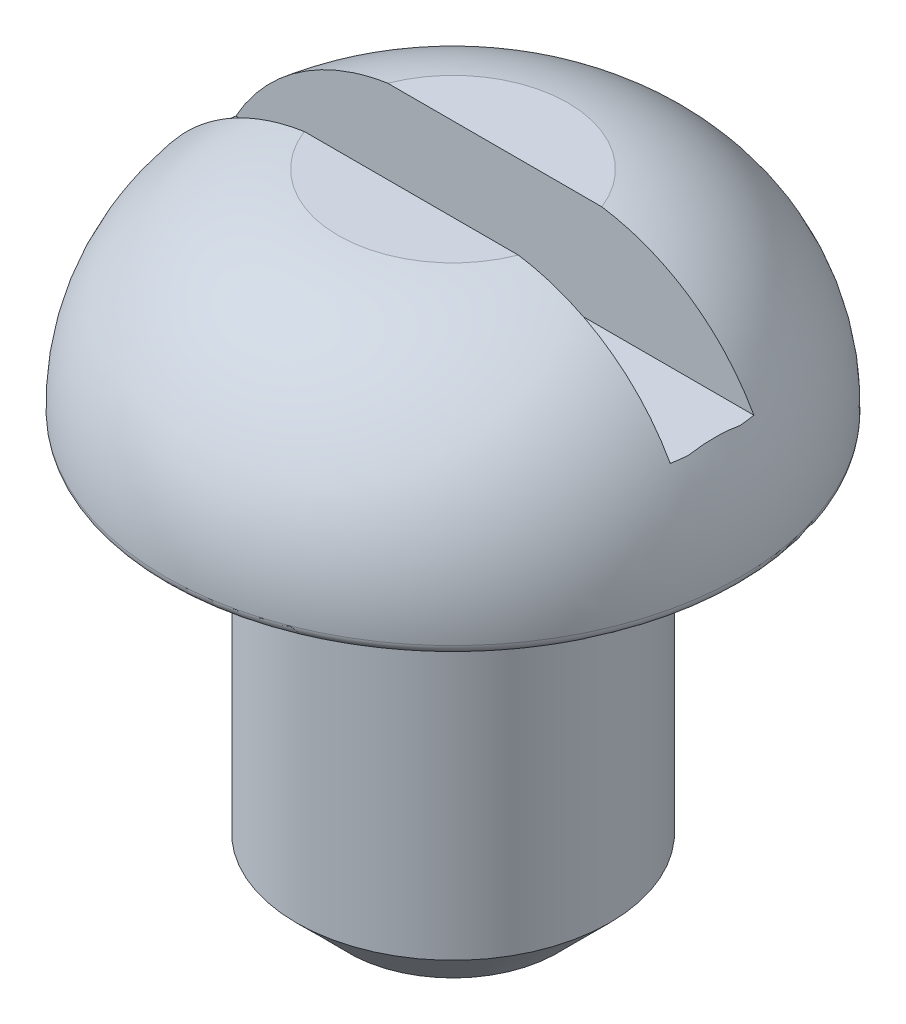
ISO-10303-21;
HEADER;
FILE_DESCRIPTION(('STEP AP214'),'2;1');
FILE_NAME('part.step','',(''),(''),'','','');
FILE_SCHEMA(('AUTOMOTIVE_DESIGN { 1 0 10303 214 1 1 1 1 }'));
ENDSEC;
DATA;
#1=APPLICATION_CONTEXT('core data for automotive mechanical design processes');
#2=APPLICATION_PROTOCOL_DEFINITION('international standard','automotive_design',2000,#1);
#3=PRODUCT_CONTEXT('',#1,'mechanical');
#4=PRODUCT('Part','Part','',(#3));
#5=PRODUCT_RELATED_PRODUCT_CATEGORY('part','',(#4));
#6=PRODUCT_DEFINITION_FORMATION('','',#4);
#7=PRODUCT_DEFINITION_CONTEXT('part definition',#1,'design');
#8=PRODUCT_DEFINITION('design','',#6,#7);
#9=PRODUCT_DEFINITION_SHAPE('','',#8);
#10=(LENGTH_UNIT() NAMED_UNIT(*) SI_UNIT(.MILLI.,.METRE.));
#11=(NAMED_UNIT(*) PLANE_ANGLE_UNIT() SI_UNIT($,.RADIAN.));
#12=(NAMED_UNIT(*) SI_UNIT($,.STERADIAN.) SOLID_ANGLE_UNIT());
#13=UNCERTAINTY_MEASURE_WITH_UNIT(LENGTH_MEASURE(1.E-05),#10,'distance_accuracy_value','');
#14=(GEOMETRIC_REPRESENTATION_CONTEXT(3) GLOBAL_UNCERTAINTY_ASSIGNED_CONTEXT((#13)) GLOBAL_UNIT_ASSIGNED_CONTEXT((#10,
#11,#12)) REPRESENTATION_CONTEXT('',''));
#15=CARTESIAN_POINT('',(0.,0.,0.));
#16=DIRECTION('',(0.,0.,1.));
#17=DIRECTION('',(1.,0.,0.));
#18=AXIS2_PLACEMENT_3D('',#15,#16,#17);
#19=CARTESIAN_POINT('',(0.,6.,0.));
#20=DIRECTION('',(0.,1.,0.));
#21=DIRECTION('',(0.,0.,1.));
#22=AXIS2_PLACEMENT_3D('',#19,#20,#21);
#23=PLANE('',#22);
#24=DIRECTION('',(-1.,0.,0.));
#25=VECTOR('',#24,1.);
#26=CARTESIAN_POINT('',(-2.5,6.,-0.4));
#27=LINE('',#26,#25);
#28=CARTESIAN_POINT('',(1.02469507659596,6.,-0.4));
#29=VERTEX_POINT('',#28);
#30=CARTESIAN_POINT('',(-1.02469507659596,6.,-0.4));
#31=VERTEX_POINT('',#30);
#32=EDGE_CURVE('E95',#29,#31,#27,.T.);
#33=ORIENTED_EDGE('',*,*,#32,.F.);
#34=CARTESIAN_POINT('',(0.,6.,0.));
#35=DIRECTION('',(0.,-1.,0.));
#36=DIRECTION('',(0.,0.,-1.));
#37=AXIS2_PLACEMENT_3D('',#34,#35,#36);
#38=CIRCLE('',#37,1.1);
#39=EDGE_CURVE('E101',#31,#29,#38,.T.);
#40=ORIENTED_EDGE('',*,*,#39,.F.);
#41=EDGE_LOOP('',(#33,#40));
#42=FACE_BOUND('',#41,.T.);
#43=ADVANCED_FACE('F29',(#42),#23,.T.);
#44=CARTESIAN_POINT('',(1.,0.,0.));
#45=DIRECTION('',(0.,-1.,0.));
#46=DIRECTION('',(0.,0.,-1.));
#47=AXIS2_PLACEMENT_3D('',#44,#45,#46);
#48=PLANE('',#47);
#49=CARTESIAN_POINT('',(0.,0.,0.));
#50=DIRECTION('',(0.,-1.,0.));
#51=DIRECTION('',(0.,0.,-1.));
#52=AXIS2_PLACEMENT_3D('',#49,#50,#51);
#53=CIRCLE('',#52,1.);
#54=CARTESIAN_POINT('',(0.,0.,-1.));
#55=VERTEX_POINT('',#54);
#56=EDGE_CURVE('E223',#55,#55,#53,.T.);
#57=ORIENTED_EDGE('',*,*,#56,.T.);
#58=EDGE_LOOP('',(#57));
#59=FACE_BOUND('',#58,.T.);
#60=ADVANCED_FACE('F31',(#59),#48,.T.);
#61=DIRECTION('',(1.,0.,0.));
#62=VECTOR('',#61,1.);
#63=CARTESIAN_POINT('',(-2.5,6.,0.4));
#64=LINE('',#63,#62);
#65=CARTESIAN_POINT('',(-1.02469507659596,6.,0.4));
#66=VERTEX_POINT('',#65);
#67=CARTESIAN_POINT('',(1.02469507659596,6.,0.4));
#68=VERTEX_POINT('',#67);
#69=EDGE_CURVE('E87',#66,#68,#64,.T.);
#70=ORIENTED_EDGE('',*,*,#69,.F.);
#71=EDGE_CURVE('E94',#68,#66,#38,.T.);
#72=ORIENTED_EDGE('',*,*,#71,.F.);
#73=EDGE_LOOP('',(#70,#72));
#74=FACE_BOUND('',#73,.T.);
#75=ADVANCED_FACE('F93',(#74),#23,.T.);
#76=CARTESIAN_POINT('',(0.,4.05009977634097,0.));
#77=DIRECTION('',(0.,-1.,0.));
#78=DIRECTION('',(0.,0.,-1.));
#79=AXIS2_PLACEMENT_3D('',#76,#77,#78);
#80=DEGENERATE_TOROIDAL_SURFACE('',#79,0.779672442615773,1.97603659537097,.T.);
#81=CARTESIAN_POINT('',(0.,5.98931855269485,0.4));
#82=CARTESIAN_POINT('',(0.0336322301279484,5.9893205716001,0.4));
#83=CARTESIAN_POINT('',(0.0672648143564294,5.99017844682175,0.4));
#84=CARTESIAN_POINT('',(0.134486048973814,5.99327874083744,0.4));
#85=CARTESIAN_POINT('',(0.168074638300507,5.99552232790957,0.4));
#86=CARTESIAN_POINT('',(0.235341692539278,6.00067558818296,0.4));
#87=CARTESIAN_POINT('',(0.269019918116884,6.00358809943584,0.4));
#88=CARTESIAN_POINT('',(0.336378018840054,6.0093648088338,0.4));
#89=CARTESIAN_POINT('',(0.370057893639487,6.01222901081593,0.4));
#90=CARTESIAN_POINT('',(0.437877287244912,6.01741118165353,0.4));
#91=CARTESIAN_POINT('',(0.472017389468459,6.01972204093967,0.4));
#92=CARTESIAN_POINT('',(0.540348220697959,6.02338246210221,0.4));
#93=CARTESIAN_POINT('',(0.57453894786776,6.02473205802703,0.4));
#94=CARTESIAN_POINT('',(0.677147719963299,6.02694911285574,0.4));
#95=CARTESIAN_POINT('',(0.745623445649575,6.02598680398458,0.4));
#96=CARTESIAN_POINT('',(0.881972396232886,6.01810011034374,0.4));
#97=CARTESIAN_POINT('',(0.949846939653068,6.01120009356238,0.4));
#98=CARTESIAN_POINT('',(1.08464932382839,5.99105274779902,0.4));
#99=CARTESIAN_POINT('',(1.1515770535867,5.97780468086785,0.4));
#100=CARTESIAN_POINT('',(1.32743905883569,5.93389987134993,0.4));
#101=CARTESIAN_POINT('',(1.43501246700903,5.89752417313684,0.4));
#102=CARTESIAN_POINT('',(1.64277375092832,5.80714096430149,0.4));
#103=CARTESIAN_POINT('',(1.74294278143891,5.75309024258769,0.4));
#104=CARTESIAN_POINT('',(1.93265776354999,5.62868178594669,0.4));
#105=CARTESIAN_POINT('',(2.02220009208707,5.55831851343564,0.4));
#106=CARTESIAN_POINT('',(2.18779655682164,5.40332750087542,0.4));
#107=CARTESIAN_POINT('',(2.26386325268286,5.31871318823931,0.4));
#108=CARTESIAN_POINT('',(2.39887936251544,5.1395132914902,0.4));
#109=CARTESIAN_POINT('',(2.4581485407167,5.04516847216825,0.4));
#110=CARTESIAN_POINT('',(2.55988756159558,4.84778550701506,0.4));
#111=CARTESIAN_POINT('',(2.60235359515437,4.74474539645659,0.4));
#112=CARTESIAN_POINT('',(2.66896720325158,4.5337422855212,0.4));
#113=CARTESIAN_POINT('',(2.69324730817994,4.4258211017661,0.4));
#114=CARTESIAN_POINT('',(2.72329499940504,4.20744823782144,0.4));
#115=CARTESIAN_POINT('',(2.72906565960174,4.09699698087495,0.4));
#116=CARTESIAN_POINT('',(2.72194370625238,3.87696236883574,0.4));
#117=CARTESIAN_POINT('',(2.70909546504866,3.76737757402577,0.4));
#118=CARTESIAN_POINT('',(2.6651805408064,3.55188571140622,0.4));
#119=CARTESIAN_POINT('',(2.63410816106256,3.44597980455422,0.4));
#120=CARTESIAN_POINT('',(2.55461964830541,3.2408306457122,0.4));
#121=CARTESIAN_POINT('',(2.50619477197843,3.14159078249458,0.4));
#122=CARTESIAN_POINT('',(2.39346155608861,2.95273088408203,0.4));
#123=CARTESIAN_POINT('',(2.32917055267637,2.86310050138865,0.4));
#124=CARTESIAN_POINT('',(2.18644835327305,2.69571647435829,0.4));
#125=CARTESIAN_POINT('',(2.10799740164991,2.61797970730241,0.4));
#126=CARTESIAN_POINT('',(1.93891521729073,2.47637070602941,0.4));
#127=CARTESIAN_POINT('',(1.84824228313099,2.4125479889316,0.4));
#128=CARTESIAN_POINT('',(1.70483704950054,2.32845353975037,0.4));
#129=CARTESIAN_POINT('',(1.65548996211767,2.30224282235778,0.4));
#130=CARTESIAN_POINT('',(1.55478898942816,2.25401999092746,0.4));
#131=CARTESIAN_POINT('',(1.50343572310356,2.23200659399396,0.4));
#132=CARTESIAN_POINT('',(1.39961052954736,2.19248489891929,0.4));
#133=CARTESIAN_POINT('',(1.347154703557,2.17493417047835,0.4));
#134=CARTESIAN_POINT('',(1.2409666890078,2.144087442157,0.4));
#135=CARTESIAN_POINT('',(1.18723349557358,2.13079491967621,0.4));
#136=CARTESIAN_POINT('',(1.06403178522894,2.10540925143501,0.4));
#137=CARTESIAN_POINT('',(0.994285023188463,2.09464216463719,0.4));
#138=CARTESIAN_POINT('',(0.889221117660143,2.08346831458643,0.4));
#139=CARTESIAN_POINT('',(0.854144078017131,2.08057337378565,0.4));
#140=CARTESIAN_POINT('',(0.783890511350764,2.07635427432128,0.4));
#141=CARTESIAN_POINT('',(0.748713977069504,2.07503023337692,0.4));
#142=CARTESIAN_POINT('',(0.677638959238742,2.07382766649051,0.4));
#143=CARTESIAN_POINT('',(0.641740038461016,2.07397842909007,0.4));
#144=CARTESIAN_POINT('',(0.569980696305403,2.07560637957031,0.4));
#145=CARTESIAN_POINT('',(0.53412026967229,2.0770833545146,0.4));
#146=CARTESIAN_POINT('',(0.462484408653184,2.08107184682247,0.4));
#147=CARTESIAN_POINT('',(0.426708933647403,2.0835826767192,0.4));
#148=CARTESIAN_POINT('',(0.355202454218464,2.08919106283036,0.4));
#149=CARTESIAN_POINT('',(0.31947145630908,2.09228869666957,0.4));
#150=CARTESIAN_POINT('',(0.242092989679405,2.09891537046343,0.4));
#151=CARTESIAN_POINT('',(0.200444216725485,2.10243104449401,0.4));
#152=CARTESIAN_POINT('',(0.117048492487841,2.10793876047994,0.4));
#153=CARTESIAN_POINT('',(0.0753016013203369,2.10993157004803,0.4));
#154=CARTESIAN_POINT('',(-0.00826329739639728,2.11128251065854,0.4));
#155=CARTESIAN_POINT('',(-0.0500813291633745,2.11063940172565,0.4));
#156=CARTESIAN_POINT('',(-0.133639653626807,2.10710338129502,0.4));
#157=CARTESIAN_POINT('',(-0.175379845783729,2.10420849425574,0.4));
#158=CARTESIAN_POINT('',(-0.258750304049282,2.09759434000434,0.4));
#159=CARTESIAN_POINT('',(-0.30038063175306,2.09387574128071,0.4));
#160=CARTESIAN_POINT('',(-0.383666399543698,2.08687617469604,0.4));
#161=CARTESIAN_POINT('',(-0.425321824593214,2.0835950450587,0.4));
#162=CARTESIAN_POINT('',(-0.50868323170659,2.07829633581178,0.4));
#163=CARTESIAN_POINT('',(-0.550389134860384,2.07627762499527,0.4));
#164=CARTESIAN_POINT('',(-0.633847536707229,2.07399446673123,0.4));
#165=CARTESIAN_POINT('',(-0.675600033238145,2.07372994101215,0.4));
#166=CARTESIAN_POINT('',(-0.79827955404354,2.07599985703047,0.4));
#167=CARTESIAN_POINT('',(-0.879185473529216,2.08139508938235,0.4));
#168=CARTESIAN_POINT('',(-1.04009545442694,2.10108936309313,0.4));
#169=CARTESIAN_POINT('',(-1.120097312929,2.11540673598556,0.4));
#170=CARTESIAN_POINT('',(-1.27744036603237,2.15313717677758,0.4));
#171=CARTESIAN_POINT('',(-1.35479443169432,2.17649630804985,0.4));
#172=CARTESIAN_POINT('',(-1.50607354050179,2.23220037272841,0.4));
#173=CARTESIAN_POINT('',(-1.58000406828913,2.26453030927327,0.4));
#174=CARTESIAN_POINT('',(-1.70066637437023,2.32620164457038,0.4));
#175=CARTESIAN_POINT('',(-1.74858977096691,2.35324055633358,0.4));
#176=CARTESIAN_POINT('',(-1.84204738578041,2.41119705677251,0.4));
#177=CARTESIAN_POINT('',(-1.88758126390447,2.4421151954546,0.4));
#178=CARTESIAN_POINT('',(-1.97648927226609,2.50805504558629,0.4));
#179=CARTESIAN_POINT('',(-2.01982815044721,2.54312436341345,0.4));
#180=CARTESIAN_POINT('',(-2.10337243061366,2.61678085845386,0.4));
#181=CARTESIAN_POINT('',(-2.14357835593788,2.65536744578403,0.4));
#182=CARTESIAN_POINT('',(-2.25876075366807,2.77572720348253,0.4));
#183=CARTESIAN_POINT('',(-2.32872619866149,2.86241560047963,0.4));
#184=CARTESIAN_POINT('',(-2.45273016359909,3.04594486934812,0.4));
#185=CARTESIAN_POINT('',(-2.50683160667456,3.14274350788808,0.4));
#186=CARTESIAN_POINT('',(-2.59789639376451,3.34393303608959,0.4));
#187=CARTESIAN_POINT('',(-2.63488542916094,3.44831227036988,0.4));
#188=CARTESIAN_POINT('',(-2.69078481684573,3.66192713634907,0.4));
#189=CARTESIAN_POINT('',(-2.70967494073831,3.77116805944685,0.4));
#190=CARTESIAN_POINT('',(-2.72872049994938,3.99083950597841,0.4));
#191=CARTESIAN_POINT('',(-2.72894896278393,4.10126370098525,0.4));
#192=CARTESIAN_POINT('',(-2.71085046679964,4.32054549822341,0.4));
#193=CARTESIAN_POINT('',(-2.69252940318255,4.42940358702928,0.4));
#194=CARTESIAN_POINT('',(-2.63788660496968,4.64243700752175,0.4));
#195=CARTESIAN_POINT('',(-2.60157509032427,4.74661496127792,0.4));
#196=CARTESIAN_POINT('',(-2.51199794489187,4.9474252587672,0.4));
#197=CARTESIAN_POINT('',(-2.45872965131868,5.04405641442852,0.4));
#198=CARTESIAN_POINT('',(-2.3366766609948,5.22719648017854,0.4));
#199=CARTESIAN_POINT('',(-2.26786608902609,5.3136881407663,0.4));
#200=CARTESIAN_POINT('',(-2.1167883019783,5.47393638064339,0.4));
#201=CARTESIAN_POINT('',(-2.03452512343716,5.54769676642615,0.4));
#202=CARTESIAN_POINT('',(-1.85845680132224,5.68087682539437,0.4));
#203=CARTESIAN_POINT('',(-1.76459390280113,5.74021998734935,0.4));
#204=CARTESIAN_POINT('',(-1.56825068819718,5.84262599868148,0.4));
#205=CARTESIAN_POINT('',(-1.46576450258911,5.88567764769672,0.4));
#206=CARTESIAN_POINT('',(-1.30705768686081,5.93767741598374,0.4));
#207=CARTESIAN_POINT('',(-1.25283407094741,5.95299054212591,0.4));
#208=CARTESIAN_POINT('',(-1.1433101061746,5.97919836316372,0.4));
#209=CARTESIAN_POINT('',(-1.0880096191571,5.99009248715328,0.4));
#210=CARTESIAN_POINT('',(-0.976811740038268,6.00751761709941,0.4));
#211=CARTESIAN_POINT('',(-0.920915266039553,6.01405456009372,0.4));
#212=CARTESIAN_POINT('',(-0.80882544781922,6.02300468210457,0.4));
#213=CARTESIAN_POINT('',(-0.752632245417605,6.02541967877984,0.4));
#214=CARTESIAN_POINT('',(-0.638202420490261,6.02659544540267,0.4));
#215=CARTESIAN_POINT('',(-0.579964874932386,6.02522189040679,0.4));
#216=CARTESIAN_POINT('',(-0.46360277126236,6.0194855430093,0.4));
#217=CARTESIAN_POINT('',(-0.405478390226013,6.015119687082,0.4));
#218=CARTESIAN_POINT('',(-0.318466264025541,6.00786026060458,0.4));
#219=CARTESIAN_POINT('',(-0.289542668712617,6.00532715255684,0.4));
#220=CARTESIAN_POINT('',(-0.231677824652627,6.00043581203148,0.4));
#221=CARTESIAN_POINT('',(-0.202736575195287,5.998077587132,0.4));
#222=CARTESIAN_POINT('',(-0.144850436771989,5.99400846001751,0.4));
#223=CARTESIAN_POINT('',(-0.115905623626878,5.99229655568349,0.4));
#224=CARTESIAN_POINT('',(-0.057973954839265,5.98995084154621,0.4));
#225=CARTESIAN_POINT('',(-0.028987108940619,5.98931681263105,0.4));
#226=CARTESIAN_POINT('',(0.,5.98931855269485,0.4));
#227=B_SPLINE_CURVE_WITH_KNOTS('',3,(#81,#82,#83,#84,#85,#86,#87,#88,#89,#90,#91,#92,#93,#94,
#95,#96,#97,#98,#99,#100,#101,#102,#103,#104,#105,#106,#107,#108,#109,#110,#111,#112,#113,#114,
#115,#116,#117,#118,#119,#120,#121,#122,#123,#124,#125,#126,#127,#128,#129,#130,#131,#132,#133,
#134,#135,#136,#137,#138,#139,#140,#141,#142,#143,#144,#145,#146,#147,#148,#149,#150,#151,#152,
#153,#154,#155,#156,#157,#158,#159,#160,#161,#162,#163,#164,#165,#166,#167,#168,#169,#170,#171,
#172,#173,#174,#175,#176,#177,#178,#179,#180,#181,#182,#183,#184,#185,#186,#187,#188,#189,#190,
#191,#192,#193,#194,#195,#196,#197,#198,#199,#200,#201,#202,#203,#204,#205,#206,#207,#208,#209,
#210,#211,#212,#213,#214,#215,#216,#217,#218,#219,#220,#221,#222,#223,#224,#225,#226),
.UNSPECIFIED.,.T.,.F.,(4,2,2,2,2,2,2,2,2,2,2,2,2,2,2,2,2,2,2,2,2,2,2,2,2,2,2,2,2,2,2,2,2,2,2,2,
2,2,2,2,2,2,2,2,2,2,2,2,2,2,2,2,2,2,2,2,2,2,2,2,2,2,2,2,2,2,2,2,2,2,2,2,4),(0.,
0.100890023684147,0.20186522294138,0.303277014523181,0.404680713008293,0.507324699032977,
0.60996504917535,0.815182329830902,1.01956140617602,1.22396424697931,1.56297001300182,
1.9028108396941,2.24276720072985,2.58240502666488,2.91506020623249,3.24779075253565,
3.57807227226821,3.90829893865739,4.23773990589672,4.56728390841,4.89699419059368,
5.22634579707033,5.55616050998684,5.88713046661354,6.05459853805703,6.2220153411517,
6.3877752381392,6.55367015739326,6.76501012148146,6.87057116918616,6.97614012686718,
7.08380979826552,7.19146218533487,7.2990431037374,7.4066382633275,7.53202567740018,
7.65734984711896,7.78273297795788,7.90822623480998,8.03361801752367,8.15896330091042,
8.28419610546772,8.40942332211289,8.65221314412581,8.89550345712301,9.1373643017585,
9.37882322878403,9.5437251905997,9.70865055909825,9.87569425907161,10.0427099954236,
10.3751757055228,10.7063043070527,11.0369341487598,11.3679330920179,11.6976366954212,
12.0272355490161,12.3566473796013,12.6861109644934,13.0161271461231,13.346044485437,
13.6776761947943,14.0095354874336,14.178415684656,14.347317693148,14.5159890849235,
14.6845860782746,14.8592368371135,15.0340666714877,15.1211717845946,15.2082806699839,
15.2952539330296,15.3822095139242),.UNSPECIFIED.);
#228=CARTESIAN_POINT('',(-2.48037267208639,5.,0.4));
#229=VERTEX_POINT('',#228);
#230=EDGE_CURVE('E11',#229,#66,#227,.T.);
#231=ORIENTED_EDGE('',*,*,#230,.F.);
#232=CARTESIAN_POINT('',(0.,5.,0.));
#233=DIRECTION('',(0.,1.,0.));
#234=DIRECTION('',(0.,0.,1.));
#235=AXIS2_PLACEMENT_3D('',#232,#233,#234);
#236=CIRCLE('',#235,2.51241887280624);
#237=CARTESIAN_POINT('',(-2.5,5.,0.24949667820031));
#238=VERTEX_POINT('',#237);
#239=EDGE_CURVE('E42',#229,#238,#236,.F.);
#240=ORIENTED_EDGE('',*,*,#239,.T.);
#241=CARTESIAN_POINT('',(-2.5,5.02231051560983,0.));
#242=CARTESIAN_POINT('',(-2.5,5.02231014613126,0.0712306788425633));
#243=CARTESIAN_POINT('',(-2.5,5.0169240888941,0.142558865114006));
#244=CARTESIAN_POINT('',(-2.5,4.99524833344987,0.283701712225144));
#245=CARTESIAN_POINT('',(-2.5,4.97893018759636,0.353511932388624));
#246=CARTESIAN_POINT('',(-2.5,4.93503448743744,0.489880588433876));
#247=CARTESIAN_POINT('',(-2.5,4.90741010654933,0.556424195769016));
#248=CARTESIAN_POINT('',(-2.5,4.8407369512236,0.683471035223088));
#249=CARTESIAN_POINT('',(-2.5,4.80171066461154,0.74398584577809));
#250=CARTESIAN_POINT('',(-2.5,4.72273078631452,0.843275760575027));
#251=CARTESIAN_POINT('',(-2.5,4.68504077468055,0.883854319520757));
#252=CARTESIAN_POINT('',(-2.5,4.60345396988963,0.958249349802385));
#253=CARTESIAN_POINT('',(-2.5,4.55955954334448,0.992068387670539));
#254=CARTESIAN_POINT('',(-2.5,4.46614541066803,1.0515647045904));
#255=CARTESIAN_POINT('',(-2.5,4.41659333803926,1.07719158850154));
#256=CARTESIAN_POINT('',(-2.5,4.31351364402817,1.11857305743128));
#257=CARTESIAN_POINT('',(-2.5,4.25998836215314,1.13433340129616));
#258=CARTESIAN_POINT('',(-2.5,4.15684471263327,1.15387563353978));
#259=CARTESIAN_POINT('',(-2.5,4.10743646195621,1.15877596536218));
#260=CARTESIAN_POINT('',(-2.5,4.0085452840721,1.15971101314125));
#261=CARTESIAN_POINT('',(-2.5,3.95906239205351,1.15574907177318));
#262=CARTESIAN_POINT('',(-2.5,3.86411851550254,1.13961207805656));
#263=CARTESIAN_POINT('',(-2.5,3.81858208628391,1.12787399445516));
#264=CARTESIAN_POINT('',(-2.5,3.73002594829075,1.09717394472953));
#265=CARTESIAN_POINT('',(-2.5,3.68700637658874,1.07821158558015));
#266=CARTESIAN_POINT('',(-2.5,3.60297401465296,1.03306389528727));
#267=CARTESIAN_POINT('',(-2.5,3.56208688516073,1.00664580851613));
#268=CARTESIAN_POINT('',(-2.5,3.48478671975293,0.947939477777542));
#269=CARTESIAN_POINT('',(-2.5,3.44837523694311,0.915649205671528));
#270=CARTESIAN_POINT('',(-2.5,3.37688415061919,0.842566073313485));
#271=CARTESIAN_POINT('',(-2.5,3.34235687266141,0.8012343830813));
#272=CARTESIAN_POINT('',(-2.5,3.27963990234518,0.714029036243393));
#273=CARTESIAN_POINT('',(-2.5,3.25145347759936,0.66815305530062));
#274=CARTESIAN_POINT('',(-2.5,3.19762640831853,0.565705611586468));
#275=CARTESIAN_POINT('',(-2.5,3.17304925893738,0.50857595225256));
#276=CARTESIAN_POINT('',(-2.5,3.13232205749344,0.391397341288984));
#277=CARTESIAN_POINT('',(-2.5,3.11617692086437,0.331346709126047));
#278=CARTESIAN_POINT('',(-2.5,3.09021129797167,0.199724484838877));
#279=CARTESIAN_POINT('',(-2.5,3.08184217840077,0.127864571020885));
#280=CARTESIAN_POINT('',(-2.5,3.07613814300471,-0.0163393775210954));
#281=CARTESIAN_POINT('',(-2.5,3.07881401975147,-0.0886838167684135));
#282=CARTESIAN_POINT('',(-2.5,3.09604186513655,-0.238852141273038));
#283=CARTESIAN_POINT('',(-2.5,3.11168190921542,-0.316555155132489));
#284=CARTESIAN_POINT('',(-2.5,3.15654537923408,-0.467928327990442));
#285=CARTESIAN_POINT('',(-2.5,3.18575221829127,-0.541603289127117));
#286=CARTESIAN_POINT('',(-2.5,3.24966259731633,-0.66574365016099));
#287=CARTESIAN_POINT('',(-2.5,3.28156459660841,-0.717654202163197));
#288=CARTESIAN_POINT('',(-2.5,3.35347835023177,-0.815560730450136));
#289=CARTESIAN_POINT('',(-2.5,3.39348640053243,-0.861559392517834));
#290=CARTESIAN_POINT('',(-2.5,3.48148468689641,-0.94600006669602));
#291=CARTESIAN_POINT('',(-2.5,3.52953463612758,-0.984380466316215));
#292=CARTESIAN_POINT('',(-2.5,3.6322573046179,-1.05096309856745));
#293=CARTESIAN_POINT('',(-2.5,3.68692394977712,-1.07917457297966));
#294=CARTESIAN_POINT('',(-2.5,3.79307039548012,-1.12047369115394));
#295=CARTESIAN_POINT('',(-2.5,3.84394870147081,-1.1351112921511));
#296=CARTESIAN_POINT('',(-2.5,3.94753962820183,-1.15459744549457));
#297=CARTESIAN_POINT('',(-2.5,4.00025091501122,-1.15945297101361));
#298=CARTESIAN_POINT('',(-2.5,4.1004596648121,-1.15911656356735));
#299=CARTESIAN_POINT('',(-2.5,4.14796294964309,-1.1548606781451));
#300=CARTESIAN_POINT('',(-2.5,4.24155559060142,-1.13837987259776));
#301=CARTESIAN_POINT('',(-2.5,4.28764514563643,-1.12615607896912));
#302=CARTESIAN_POINT('',(-2.5,4.37694763368273,-1.09439743039534));
#303=CARTESIAN_POINT('',(-2.5,4.42017402232899,-1.07490012929803));
#304=CARTESIAN_POINT('',(-2.5,4.50305034194318,-1.02941245372522));
#305=CARTESIAN_POINT('',(-2.5,4.54269937916833,-1.00342046273776));
#306=CARTESIAN_POINT('',(-2.5,4.62055136516311,-0.943733525554364));
#307=CARTESIAN_POINT('',(-2.5,4.6584219937318,-0.909606632222672));
#308=CARTESIAN_POINT('',(-2.5,4.72871751030709,-0.836166720546381));
#309=CARTESIAN_POINT('',(-2.5,4.76114062595824,-0.796852021741519));
#310=CARTESIAN_POINT('',(-2.5,4.82428707291293,-0.708603935542905));
#311=CARTESIAN_POINT('',(-2.5,4.85419467708597,-0.659088099147598));
#312=CARTESIAN_POINT('',(-2.5,4.90664449994322,-0.556273142143709));
#313=CARTESIAN_POINT('',(-2.5,4.92917840946965,-0.502969835297219));
#314=CARTESIAN_POINT('',(-2.5,4.9700907472227,-0.384754626029003));
#315=CARTESIAN_POINT('',(-2.5,4.98715155139994,-0.319388131208308));
#316=CARTESIAN_POINT('',(-2.5,5.01150494008411,-0.18696480593488));
#317=CARTESIAN_POINT('',(-2.5,5.01881409678225,-0.119911041019669));
#318=CARTESIAN_POINT('',(-2.5,5.02198216855268,-0.0351795517586168));
#319=CARTESIAN_POINT('',(-2.5,5.02231060686467,-0.0175927498795483));
#320=CARTESIAN_POINT('',(-2.5,5.02231051560983,0.));
#321=B_SPLINE_CURVE_WITH_KNOTS('',3,(#241,#242,#243,#244,#245,#246,#247,#248,#249,#250,#251,
#252,#253,#254,#255,#256,#257,#258,#259,#260,#261,#262,#263,#264,#265,#266,#267,#268,#269,#270,
#271,#272,#273,#274,#275,#276,#277,#278,#279,#280,#281,#282,#283,#284,#285,#286,#287,#288,#289,
#290,#291,#292,#293,#294,#295,#296,#297,#298,#299,#300,#301,#302,#303,#304,#305,#306,#307,#308,
#309,#310,#311,#312,#313,#314,#315,#316,#317,#318,#319,#320),.UNSPECIFIED.,.T.,.F.,(4,2,2,2,2,2,
2,2,2,2,2,2,2,2,2,2,2,2,2,2,2,2,2,2,2,2,2,2,2,2,2,2,2,2,2,2,2,2,2,4),(0.,0.213654058428576,
0.427866261467031,0.642974783844953,0.857661882047721,1.02313256849238,1.18854030728179,
1.35494682143161,1.52125611759126,1.6694369131548,1.81756182725976,1.95799843379395,
2.09844268164834,2.24387837543208,2.38936439560361,2.55030448513531,2.71132732241044,
2.89719032712376,3.08316155989775,3.29930936619596,3.51566843039356,3.7522771145924,
3.98859727727576,4.17066050848427,4.35264073342776,4.53603759006511,4.71926734814893,
4.87720820490712,5.03503643330442,5.17743169042945,5.31980682019252,5.46145680385799,
5.60314207902792,5.75546979409162,5.90784697360662,6.08072712684902,6.25380142712087,
6.45570811901972,6.65727124675774,6.71004011646053),.UNSPECIFIED.);
#322=CARTESIAN_POINT('',(-2.5,5.,-0.24949667820031));
#323=VERTEX_POINT('',#322);
#324=EDGE_CURVE('E33',#323,#238,#321,.T.);
#325=ORIENTED_EDGE('',*,*,#324,.F.);
#326=CARTESIAN_POINT('',(-2.48037267208639,5.,-0.4));
#327=VERTEX_POINT('',#326);
#328=EDGE_CURVE('E202',#323,#327,#236,.F.);
#329=ORIENTED_EDGE('',*,*,#328,.T.);
#330=CARTESIAN_POINT('',(0.,5.98931855269485,-0.4));
#331=CARTESIAN_POINT('',(-0.0336322301279488,5.9893205716001,-0.4));
#332=CARTESIAN_POINT('',(-0.0672648143564298,5.99017844682175,-0.4));
#333=CARTESIAN_POINT('',(-0.134486048973815,5.99327874083744,-0.4));
#334=CARTESIAN_POINT('',(-0.168074638300507,5.99552232790957,-0.4));
#335=CARTESIAN_POINT('',(-0.235341692539279,6.00067558818296,-0.4));
#336=CARTESIAN_POINT('',(-0.269019918116885,6.00358809943584,-0.4));
#337=CARTESIAN_POINT('',(-0.336378018840054,6.0093648088338,-0.4));
#338=CARTESIAN_POINT('',(-0.370057893639487,6.01222901081593,-0.4));
#339=CARTESIAN_POINT('',(-0.437877287244913,6.01741118165353,-0.4));
#340=CARTESIAN_POINT('',(-0.47201738946846,6.01972204093967,-0.4));
#341=CARTESIAN_POINT('',(-0.54034822069796,6.02338246210221,-0.4));
#342=CARTESIAN_POINT('',(-0.57453894786776,6.02473205802703,-0.4));
#343=CARTESIAN_POINT('',(-0.6771477199633,6.02694911285574,-0.4));
#344=CARTESIAN_POINT('',(-0.745623445649575,6.02598680398458,-0.4));
#345=CARTESIAN_POINT('',(-0.881972396232887,6.01810011034374,-0.4));
#346=CARTESIAN_POINT('',(-0.949846939653069,6.01120009356238,-0.4));
#347=CARTESIAN_POINT('',(-1.08464932382839,5.99105274779902,-0.4));
#348=CARTESIAN_POINT('',(-1.1515770535867,5.97780468086785,-0.4));
#349=CARTESIAN_POINT('',(-1.32743905883569,5.93389987134993,-0.4));
#350=CARTESIAN_POINT('',(-1.43501246700903,5.89752417313684,-0.4));
#351=CARTESIAN_POINT('',(-1.64277375092832,5.80714096430149,-0.4));
#352=CARTESIAN_POINT('',(-1.74294278143891,5.75309024258769,-0.4));
#353=CARTESIAN_POINT('',(-1.93265776354999,5.62868178594669,-0.4));
#354=CARTESIAN_POINT('',(-2.02220009208707,5.55831851343564,-0.4));
#355=CARTESIAN_POINT('',(-2.18779655682164,5.40332750087542,-0.4));
#356=CARTESIAN_POINT('',(-2.26386325268286,5.31871318823931,-0.4));
#357=CARTESIAN_POINT('',(-2.39887936251544,5.1395132914902,-0.4));
#358=CARTESIAN_POINT('',(-2.4581485407167,5.04516847216825,-0.4));
#359=CARTESIAN_POINT('',(-2.55988756159559,4.84778550701506,-0.4));
#360=CARTESIAN_POINT('',(-2.60235359515437,4.74474539645659,-0.4));
#361=CARTESIAN_POINT('',(-2.66896720325158,4.5337422855212,-0.4));
#362=CARTESIAN_POINT('',(-2.69324730817994,4.4258211017661,-0.4));
#363=CARTESIAN_POINT('',(-2.72329499940504,4.20744823782144,-0.4));
#364=CARTESIAN_POINT('',(-2.72906565960174,4.09699698087495,-0.4));
#365=CARTESIAN_POINT('',(-2.72194370625238,3.87696236883574,-0.4));
#366=CARTESIAN_POINT('',(-2.70909546504866,3.76737757402577,-0.4));
#367=CARTESIAN_POINT('',(-2.6651805408064,3.55188571140622,-0.4));
#368=CARTESIAN_POINT('',(-2.63410816106256,3.44597980455422,-0.4));
#369=CARTESIAN_POINT('',(-2.55461964830541,3.2408306457122,-0.4));
#370=CARTESIAN_POINT('',(-2.50619477197843,3.14159078249458,-0.4));
#371=CARTESIAN_POINT('',(-2.39346155608861,2.95273088408203,-0.4));
#372=CARTESIAN_POINT('',(-2.32917055267637,2.86310050138865,-0.4));
#373=CARTESIAN_POINT('',(-2.18644835327305,2.69571647435829,-0.4));
#374=CARTESIAN_POINT('',(-2.10799740164991,2.6179797073024,-0.4));
#375=CARTESIAN_POINT('',(-1.93891521729073,2.47637070602941,-0.4));
#376=CARTESIAN_POINT('',(-1.84824228313099,2.4125479889316,-0.4));
#377=CARTESIAN_POINT('',(-1.70483704950054,2.32845353975036,-0.4));
#378=CARTESIAN_POINT('',(-1.65548996211767,2.30224282235778,-0.4));
#379=CARTESIAN_POINT('',(-1.55478898942816,2.25401999092746,-0.4));
#380=CARTESIAN_POINT('',(-1.50343572310356,2.23200659399396,-0.4));
#381=CARTESIAN_POINT('',(-1.39961052954736,2.19248489891929,-0.4));
#382=CARTESIAN_POINT('',(-1.34715470355699,2.17493417047835,-0.4));
#383=CARTESIAN_POINT('',(-1.2409666890078,2.144087442157,-0.4));
#384=CARTESIAN_POINT('',(-1.18723349557358,2.1307949196762,-0.4));
#385=CARTESIAN_POINT('',(-1.06403178522894,2.10540925143501,-0.4));
#386=CARTESIAN_POINT('',(-0.99428502318846,2.09464216463719,-0.4));
#387=CARTESIAN_POINT('',(-0.88922111766014,2.08346831458643,-0.4));
#388=CARTESIAN_POINT('',(-0.854144078017128,2.08057337378565,-0.4));
#389=CARTESIAN_POINT('',(-0.783890511350761,2.07635427432128,-0.4));
#390=CARTESIAN_POINT('',(-0.748713977069501,2.07503023337692,-0.4));
#391=CARTESIAN_POINT('',(-0.677638959238738,2.07382766649051,-0.4));
#392=CARTESIAN_POINT('',(-0.641740038461012,2.07397842909007,-0.4));
#393=CARTESIAN_POINT('',(-0.569980696305399,2.07560637957031,-0.4));
#394=CARTESIAN_POINT('',(-0.534120269672286,2.07708335451461,-0.4));
#395=CARTESIAN_POINT('',(-0.462484408653179,2.08107184682247,-0.4));
#396=CARTESIAN_POINT('',(-0.426708933647398,2.0835826767192,-0.4));
#397=CARTESIAN_POINT('',(-0.355202454218459,2.08919106283036,-0.4));
#398=CARTESIAN_POINT('',(-0.319471456309075,2.09228869666957,-0.4));
#399=CARTESIAN_POINT('',(-0.242092989679399,2.09891537046343,-0.4));
#400=CARTESIAN_POINT('',(-0.200444216725479,2.10243104449401,-0.4));
#401=CARTESIAN_POINT('',(-0.117048492487834,2.10793876047994,-0.4));
#402=CARTESIAN_POINT('',(-0.0753016013203298,2.10993157004803,-0.4));
#403=CARTESIAN_POINT('',(0.00826329739640518,2.11128251065854,-0.4));
#404=CARTESIAN_POINT('',(0.0500813291633829,2.11063940172565,-0.4));
#405=CARTESIAN_POINT('',(0.133639653626816,2.10710338129502,-0.4));
#406=CARTESIAN_POINT('',(0.175379845783738,2.10420849425574,-0.4));
#407=CARTESIAN_POINT('',(0.258750304049292,2.09759434000434,-0.4));
#408=CARTESIAN_POINT('',(0.300380631753071,2.09387574128071,-0.4));
#409=CARTESIAN_POINT('',(0.38366639954371,2.08687617469604,-0.4));
#410=CARTESIAN_POINT('',(0.425321824593225,2.0835950450587,-0.4));
#411=CARTESIAN_POINT('',(0.508683231706601,2.07829633581178,-0.4));
#412=CARTESIAN_POINT('',(0.550389134860395,2.07627762499527,-0.4));
#413=CARTESIAN_POINT('',(0.633847536707242,2.07399446673123,-0.4));
#414=CARTESIAN_POINT('',(0.675600033238158,2.07372994101215,-0.4));
#415=CARTESIAN_POINT('',(0.798279554043554,2.07599985703047,-0.4));
#416=CARTESIAN_POINT('',(0.87918547352923,2.08139508938235,-0.4));
#417=CARTESIAN_POINT('',(1.04009545442696,2.10108936309313,-0.4));
#418=CARTESIAN_POINT('',(1.12009731292901,2.11540673598557,-0.4));
#419=CARTESIAN_POINT('',(1.27744036603239,2.15313717677759,-0.4));
#420=CARTESIAN_POINT('',(1.35479443169434,2.17649630804985,-0.4));
#421=CARTESIAN_POINT('',(1.50607354050181,2.23220037272842,-0.4));
#422=CARTESIAN_POINT('',(1.58000406828915,2.26453030927328,-0.4));
#423=CARTESIAN_POINT('',(1.70066637437024,2.3262016445704,-0.4));
#424=CARTESIAN_POINT('',(1.74858977096693,2.35324055633359,-0.4));
#425=CARTESIAN_POINT('',(1.84204738578043,2.41119705677252,-0.4));
#426=CARTESIAN_POINT('',(1.88758126390449,2.44211519545461,-0.400000000000001));
#427=CARTESIAN_POINT('',(1.9764892722661,2.50805504558631,-0.400000000000001));
#428=CARTESIAN_POINT('',(2.01982815044722,2.54312436341346,-0.400000000000001));
#429=CARTESIAN_POINT('',(2.10337243061368,2.61678085845388,-0.400000000000001));
#430=CARTESIAN_POINT('',(2.1435783559379,2.65536744578404,-0.400000000000001));
#431=CARTESIAN_POINT('',(2.25876075366808,2.77572720348254,-0.400000000000001));
#432=CARTESIAN_POINT('',(2.32872619866151,2.86241560047965,-0.400000000000001));
#433=CARTESIAN_POINT('',(2.4527301635991,3.04594486934814,-0.400000000000001));
#434=CARTESIAN_POINT('',(2.50683160667457,3.1427435078881,-0.400000000000001));
#435=CARTESIAN_POINT('',(2.59789639376452,3.34393303608961,-0.400000000000001));
#436=CARTESIAN_POINT('',(2.63488542916094,3.4483122703699,-0.400000000000001));
#437=CARTESIAN_POINT('',(2.69078481684574,3.66192713634909,-0.400000000000001));
#438=CARTESIAN_POINT('',(2.70967494073832,3.77116805944687,-0.400000000000001));
#439=CARTESIAN_POINT('',(2.72872049994938,3.99083950597843,-0.400000000000001));
#440=CARTESIAN_POINT('',(2.72894896278393,4.10126370098527,-0.400000000000001));
#441=CARTESIAN_POINT('',(2.71085046679964,4.32054549822343,-0.400000000000001));
#442=CARTESIAN_POINT('',(2.69252940318255,4.4294035870293,-0.400000000000001));
#443=CARTESIAN_POINT('',(2.63788660496968,4.64243700752177,-0.400000000000001));
#444=CARTESIAN_POINT('',(2.60157509032426,4.74661496127793,-0.400000000000001));
#445=CARTESIAN_POINT('',(2.51199794489186,4.94742525876722,-0.400000000000001));
#446=CARTESIAN_POINT('',(2.45872965131867,5.04405641442854,-0.400000000000001));
#447=CARTESIAN_POINT('',(2.33667666099478,5.22719648017856,-0.400000000000001));
#448=CARTESIAN_POINT('',(2.26786608902607,5.31368814076631,-0.400000000000001));
#449=CARTESIAN_POINT('',(2.11678830197828,5.4739363806434,-0.400000000000001));
#450=CARTESIAN_POINT('',(2.03452512343714,5.54769676642617,-0.400000000000001));
#451=CARTESIAN_POINT('',(1.85845680132223,5.68087682539438,-0.400000000000001));
#452=CARTESIAN_POINT('',(1.76459390280111,5.74021998734936,-0.4));
#453=CARTESIAN_POINT('',(1.56825068819717,5.84262599868149,-0.4));
#454=CARTESIAN_POINT('',(1.46576450258909,5.88567764769672,-0.4));
#455=CARTESIAN_POINT('',(1.30705768686079,5.93767741598375,-0.4));
#456=CARTESIAN_POINT('',(1.25283407094739,5.95299054212592,-0.4));
#457=CARTESIAN_POINT('',(1.14331010617458,5.97919836316372,-0.4));
#458=CARTESIAN_POINT('',(1.08800961915708,5.99009248715328,-0.4));
#459=CARTESIAN_POINT('',(0.976811740038249,6.00751761709941,-0.4));
#460=CARTESIAN_POINT('',(0.920915266039533,6.01405456009372,-0.4));
#461=CARTESIAN_POINT('',(0.8088254478192,6.02300468210458,-0.4));
#462=CARTESIAN_POINT('',(0.752632245417584,6.02541967877984,-0.4));
#463=CARTESIAN_POINT('',(0.638202420490242,6.02659544540267,-0.4));
#464=CARTESIAN_POINT('',(0.579964874932368,6.02522189040679,-0.4));
#465=CARTESIAN_POINT('',(0.463602771262345,6.0194855430093,-0.4));
#466=CARTESIAN_POINT('',(0.405478390226,6.01511968708199,-0.4));
#467=CARTESIAN_POINT('',(0.318466264025531,6.00786026060458,-0.4));
#468=CARTESIAN_POINT('',(0.289542668712608,6.00532715255684,-0.4));
#469=CARTESIAN_POINT('',(0.23167782465262,6.00043581203148,-0.4));
#470=CARTESIAN_POINT('',(0.20273657519528,5.998077587132,-0.4));
#471=CARTESIAN_POINT('',(0.144850436771984,5.99400846001751,-0.4));
#472=CARTESIAN_POINT('',(0.115905623626873,5.99229655568349,-0.4));
#473=CARTESIAN_POINT('',(0.0579739548392621,5.98995084154621,-0.4));
#474=CARTESIAN_POINT('',(0.0289871089406174,5.98931681263105,-0.4));
#475=CARTESIAN_POINT('',(0.,5.98931855269485,-0.4));
#476=B_SPLINE_CURVE_WITH_KNOTS('',3,(#330,#331,#332,#333,#334,#335,#336,#337,#338,#339,#340,
#341,#342,#343,#344,#345,#346,#347,#348,#349,#350,#351,#352,#353,#354,#355,#356,#357,#358,#359,
#360,#361,#362,#363,#364,#365,#366,#367,#368,#369,#370,#371,#372,#373,#374,#375,#376,#377,#378,
#379,#380,#381,#382,#383,#384,#385,#386,#387,#388,#389,#390,#391,#392,#393,#394,#395,#396,#397,
#398,#399,#400,#401,#402,#403,#404,#405,#406,#407,#408,#409,#410,#411,#412,#413,#414,#415,#416,
#417,#418,#419,#420,#421,#422,#423,#424,#425,#426,#427,#428,#429,#430,#431,#432,#433,#434,#435,
#436,#437,#438,#439,#440,#441,#442,#443,#444,#445,#446,#447,#448,#449,#450,#451,#452,#453,#454,
#455,#456,#457,#458,#459,#460,#461,#462,#463,#464,#465,#466,#467,#468,#469,#470,#471,#472,#473,
#474,#475),.UNSPECIFIED.,.T.,.F.,(4,2,2,2,2,2,2,2,2,2,2,2,2,2,2,2,2,2,2,2,2,2,2,2,2,2,2,2,2,2,2,
2,2,2,2,2,2,2,2,2,2,2,2,2,2,2,2,2,2,2,2,2,2,2,2,2,2,2,2,2,2,2,2,2,2,2,2,2,2,2,2,2,4),(0.,
0.100890023684147,0.20186522294138,0.303277014523181,0.404680713008293,0.507324699032977,
0.60996504917535,0.815182329830903,1.01956140617603,1.22396424697931,1.56297001300182,
1.9028108396941,2.24276720072985,2.58240502666488,2.91506020623249,3.24779075253565,
3.57807227226821,3.90829893865739,4.23773990589672,4.56728390841001,4.89699419059369,
5.22634579707033,5.55616050998684,5.88713046661354,6.05459853805703,6.2220153411517,
6.3877752381392,6.55367015739327,6.76501012148147,6.87057116918616,6.97614012686718,
7.08380979826553,7.19146218533487,7.2990431037374,7.40663826332751,7.53202567740019,
7.65734984711897,7.78273297795789,7.90822623480999,8.03361801752368,8.15896330091043,
8.28419610546773,8.4094233221129,8.65221314412583,8.89550345712303,9.13736430175851,
9.37882322878405,9.54372519059972,9.70865055909827,9.87569425907163,10.0427099954236,
10.3751757055228,10.7063043070527,11.0369341487598,11.3679330920179,11.6976366954213,
12.0272355490161,12.3566473796013,12.6861109644934,13.0161271461232,13.346044485437,
13.6776761947943,14.0095354874336,14.178415684656,14.347317693148,14.5159890849235,
14.6845860782746,14.8592368371136,15.0340666714877,15.1211717845946,15.208280669984,
15.2952539330296,15.3822095139242),.UNSPECIFIED.);
#477=EDGE_CURVE('E203',#31,#327,#476,.T.);
#478=ORIENTED_EDGE('',*,*,#477,.F.);
#479=ORIENTED_EDGE('',*,*,#39,.T.);
#480=CARTESIAN_POINT('',(2.48037267208639,5.,-0.400000000000001));
#481=VERTEX_POINT('',#480);
#482=EDGE_CURVE('E199',#481,#29,#476,.T.);
#483=ORIENTED_EDGE('',*,*,#482,.F.);
#484=CARTESIAN_POINT('',(2.5,5.,-0.249496678200316));
#485=VERTEX_POINT('',#484);
#486=EDGE_CURVE('E114',#481,#485,#236,.F.);
#487=ORIENTED_EDGE('',*,*,#486,.T.);
#488=CARTESIAN_POINT('',(2.5,5.02231051560983,0.));
#489=CARTESIAN_POINT('',(2.5,5.02231014613126,-0.071230678842564));
#490=CARTESIAN_POINT('',(2.5,5.0169240888941,-0.142558865114007));
#491=CARTESIAN_POINT('',(2.5,4.99524833344988,-0.283701712225146));
#492=CARTESIAN_POINT('',(2.5,4.97893018759636,-0.353511932388625));
#493=CARTESIAN_POINT('',(2.5,4.93503448743744,-0.489880588433878));
#494=CARTESIAN_POINT('',(2.5,4.90741010654933,-0.556424195769019));
#495=CARTESIAN_POINT('',(2.5,4.8407369512236,-0.68347103522309));
#496=CARTESIAN_POINT('',(2.5,4.80171066461154,-0.743985845778092));
#497=CARTESIAN_POINT('',(2.5,4.72273078631452,-0.84327576057503));
#498=CARTESIAN_POINT('',(2.5,4.68504077468055,-0.883854319520759));
#499=CARTESIAN_POINT('',(2.5,4.60345396988963,-0.958249349802387));
#500=CARTESIAN_POINT('',(2.5,4.55955954334449,-0.992068387670542));
#501=CARTESIAN_POINT('',(2.5,4.46614541066803,-1.0515647045904));
#502=CARTESIAN_POINT('',(2.5,4.41659333803926,-1.07719158850154));
#503=CARTESIAN_POINT('',(2.5,4.31351364402817,-1.11857305743128));
#504=CARTESIAN_POINT('',(2.5,4.25998836215314,-1.13433340129616));
#505=CARTESIAN_POINT('',(2.5,4.15684471263328,-1.15387563353978));
#506=CARTESIAN_POINT('',(2.5,4.10743646195621,-1.15877596536218));
#507=CARTESIAN_POINT('',(2.5,4.0085452840721,-1.15971101314126));
#508=CARTESIAN_POINT('',(2.5,3.95906239205351,-1.15574907177318));
#509=CARTESIAN_POINT('',(2.5,3.86411851550255,-1.13961207805657));
#510=CARTESIAN_POINT('',(2.5,3.81858208628392,-1.12787399445517));
#511=CARTESIAN_POINT('',(2.5,3.73002594829075,-1.09717394472954));
#512=CARTESIAN_POINT('',(2.5,3.68700637658874,-1.07821158558015));
#513=CARTESIAN_POINT('',(2.5,3.60297401465296,-1.03306389528727));
#514=CARTESIAN_POINT('',(2.5,3.56208688516073,-1.00664580851613));
#515=CARTESIAN_POINT('',(2.5,3.48478671975293,-0.947939477777546));
#516=CARTESIAN_POINT('',(2.5,3.44837523694311,-0.915649205671532));
#517=CARTESIAN_POINT('',(2.5,3.37688415061919,-0.842566073313489));
#518=CARTESIAN_POINT('',(2.5,3.34235687266141,-0.801234383081304));
#519=CARTESIAN_POINT('',(2.5,3.27963990234519,-0.714029036243398));
#520=CARTESIAN_POINT('',(2.5,3.25145347759936,-0.668153055300625));
#521=CARTESIAN_POINT('',(2.5,3.19762640831853,-0.565705611586473));
#522=CARTESIAN_POINT('',(2.5,3.17304925893738,-0.508575952252565));
#523=CARTESIAN_POINT('',(2.5,3.13232205749344,-0.39139734128899));
#524=CARTESIAN_POINT('',(2.5,3.11617692086437,-0.331346709126052));
#525=CARTESIAN_POINT('',(2.5,3.09021129797167,-0.199724484838881));
#526=CARTESIAN_POINT('',(2.5,3.08184217840077,-0.12786457102089));
#527=CARTESIAN_POINT('',(2.5,3.07613814300471,0.0163393775210904));
#528=CARTESIAN_POINT('',(2.5,3.07881401975147,0.0886838167684084));
#529=CARTESIAN_POINT('',(2.5,3.09604186513654,0.238852141273034));
#530=CARTESIAN_POINT('',(2.5,3.11168190921541,0.316555155132485));
#531=CARTESIAN_POINT('',(2.5,3.15654537923407,0.467928327990438));
#532=CARTESIAN_POINT('',(2.5,3.18575221829127,0.541603289127112));
#533=CARTESIAN_POINT('',(2.5,3.24966259731633,0.665743650160986));
#534=CARTESIAN_POINT('',(2.5,3.28156459660841,0.717654202163193));
#535=CARTESIAN_POINT('',(2.5,3.35347835023177,0.815560730450132));
#536=CARTESIAN_POINT('',(2.5,3.39348640053243,0.861559392517831));
#537=CARTESIAN_POINT('',(2.5,3.48148468689641,0.946000066696018));
#538=CARTESIAN_POINT('',(2.5,3.52953463612758,0.984380466316213));
#539=CARTESIAN_POINT('',(2.5,3.6322573046179,1.05096309856745));
#540=CARTESIAN_POINT('',(2.5,3.68692394977712,1.07917457297966));
#541=CARTESIAN_POINT('',(2.5,3.79307039548012,1.12047369115394));
#542=CARTESIAN_POINT('',(2.5,3.84394870147081,1.1351112921511));
#543=CARTESIAN_POINT('',(2.5,3.94753962820183,1.15459744549457));
#544=CARTESIAN_POINT('',(2.5,4.00025091501122,1.15945297101361));
#545=CARTESIAN_POINT('',(2.5,4.1004596648121,1.15911656356735));
#546=CARTESIAN_POINT('',(2.5,4.14796294964309,1.1548606781451));
#547=CARTESIAN_POINT('',(2.5,4.24155559060142,1.13837987259776));
#548=CARTESIAN_POINT('',(2.5,4.28764514563643,1.12615607896912));
#549=CARTESIAN_POINT('',(2.5,4.37694763368273,1.09439743039534));
#550=CARTESIAN_POINT('',(2.5,4.42017402232899,1.07490012929803));
#551=CARTESIAN_POINT('',(2.5,4.50305034194318,1.02941245372522));
#552=CARTESIAN_POINT('',(2.5,4.54269937916833,1.00342046273776));
#553=CARTESIAN_POINT('',(2.5,4.62055136516311,0.943733525554365));
#554=CARTESIAN_POINT('',(2.5,4.6584219937318,0.909606632222673));
#555=CARTESIAN_POINT('',(2.5,4.72871751030709,0.836166720546382));
#556=CARTESIAN_POINT('',(2.5,4.76114062595824,0.79685202174152));
#557=CARTESIAN_POINT('',(2.5,4.82428707291293,0.708603935542907));
#558=CARTESIAN_POINT('',(2.5,4.85419467708597,0.659088099147599));
#559=CARTESIAN_POINT('',(2.5,4.90664449994322,0.55627314214371));
#560=CARTESIAN_POINT('',(2.5,4.92917840946965,0.50296983529722));
#561=CARTESIAN_POINT('',(2.5,4.9700907472227,0.384754626029005));
#562=CARTESIAN_POINT('',(2.5,4.98715155139994,0.31938813120831));
#563=CARTESIAN_POINT('',(2.5,5.01150494008411,0.186964805934882));
#564=CARTESIAN_POINT('',(2.5,5.01881409678225,0.119911041019671));
#565=CARTESIAN_POINT('',(2.5,5.02198216855268,0.0351795517586177));
#566=CARTESIAN_POINT('',(2.5,5.02231060686467,0.0175927498795485));
#567=CARTESIAN_POINT('',(2.5,5.02231051560983,0.));
#568=B_SPLINE_CURVE_WITH_KNOTS('',3,(#488,#489,#490,#491,#492,#493,#494,#495,#496,#497,#498,
#499,#500,#501,#502,#503,#504,#505,#506,#507,#508,#509,#510,#511,#512,#513,#514,#515,#516,#517,
#518,#519,#520,#521,#522,#523,#524,#525,#526,#527,#528,#529,#530,#531,#532,#533,#534,#535,#536,
#537,#538,#539,#540,#541,#542,#543,#544,#545,#546,#547,#548,#549,#550,#551,#552,#553,#554,#555,
#556,#557,#558,#559,#560,#561,#562,#563,#564,#565,#566,#567),.UNSPECIFIED.,.T.,.F.,(4,2,2,2,2,2,
2,2,2,2,2,2,2,2,2,2,2,2,2,2,2,2,2,2,2,2,2,2,2,2,2,2,2,2,2,2,2,2,2,4),(0.,0.213654058428577,
0.427866261467033,0.642974783844955,0.857661882047724,1.02313256849238,1.18854030728179,
1.35494682143161,1.52125611759127,1.6694369131548,1.81756182725976,1.95799843379395,
2.09844268164834,2.24387837543208,2.38936439560362,2.55030448513531,2.71132732241044,
2.89719032712376,3.08316155989775,3.29930936619596,3.51566843039356,3.7522771145924,
3.98859727727577,4.17066050848427,4.35264073342777,4.53603759006512,4.71926734814893,
4.87720820490713,5.03503643330442,5.17743169042945,5.31980682019253,5.46145680385799,
5.60314207902792,5.75546979409162,5.90784697360663,6.08072712684903,6.25380142712087,
6.45570811901972,6.65727124675775,6.71004011646054),.UNSPECIFIED.);
#569=CARTESIAN_POINT('',(2.5,5.,0.249496678200314));
#570=VERTEX_POINT('',#569);
#571=EDGE_CURVE('E119',#570,#485,#568,.T.);
#572=ORIENTED_EDGE('',*,*,#571,.F.);
#573=CARTESIAN_POINT('',(2.48037267208639,5.,0.4));
#574=VERTEX_POINT('',#573);
#575=EDGE_CURVE('E113',#570,#574,#236,.F.);
#576=ORIENTED_EDGE('',*,*,#575,.T.);
#577=EDGE_CURVE('E44',#68,#574,#227,.T.);
#578=ORIENTED_EDGE('',*,*,#577,.F.);
#579=ORIENTED_EDGE('',*,*,#71,.T.);
#580=EDGE_LOOP('',(#231,#240,#325,#329,#478,#479,#483,#487,#572,#576,#578,#579));
#581=FACE_BOUND('',#580,.T.);
#582=CARTESIAN_POINT('',(0.,3.99732948832317,0.));
#583=DIRECTION('',(0.,1.,0.));
#584=DIRECTION('',(0.,0.,1.));
#585=AXIS2_PLACEMENT_3D('',#582,#583,#584);
#586=CIRCLE('',#585,2.75500429396324);
#587=CARTESIAN_POINT('',(0.,3.99732948832317,2.75500429396324));
#588=VERTEX_POINT('',#587);
#589=EDGE_CURVE('E104',#588,#588,#586,.T.);
#590=ORIENTED_EDGE('',*,*,#589,.T.);
#591=EDGE_LOOP('',(#590));
#592=FACE_BOUND('',#591,.T.);
#593=ADVANCED_FACE('F97',(#581,#592),#80,.T.);
#594=CARTESIAN_POINT('',(2.75,3.9,0.));
#595=DIRECTION('',(0.,-1.,0.));
#596=DIRECTION('',(0.,0.,-1.));
#597=AXIS2_PLACEMENT_3D('',#594,#595,#596);
#598=PLANE('',#597);
#599=CARTESIAN_POINT('',(0.,3.9,0.));
#600=DIRECTION('',(0.,-1.,0.));
#601=DIRECTION('',(0.,0.,-1.));
#602=AXIS2_PLACEMENT_3D('',#599,#600,#601);
#603=CIRCLE('',#602,2.65503995848611);
#604=CARTESIAN_POINT('',(0.,3.9,-2.65503995848611));
#605=VERTEX_POINT('',#604);
#606=EDGE_CURVE('E100',#605,#605,#603,.T.);
#607=ORIENTED_EDGE('',*,*,#606,.T.);
#608=EDGE_LOOP('',(#607));
#609=FACE_BOUND('',#608,.T.);
#610=CARTESIAN_POINT('',(0.,3.9,0.));
#611=DIRECTION('',(0.,-1.,0.));
#612=DIRECTION('',(0.,0.,-1.));
#613=AXIS2_PLACEMENT_3D('',#610,#611,#612);
#614=CIRCLE('',#613,1.5);
#615=CARTESIAN_POINT('',(0.,3.9,-1.5));
#616=VERTEX_POINT('',#615);
#617=EDGE_CURVE('E107',#616,#616,#614,.T.);
#618=ORIENTED_EDGE('',*,*,#617,.F.);
#619=EDGE_LOOP('',(#618));
#620=FACE_BOUND('',#619,.T.);
#621=ADVANCED_FACE('F147',(#609,#620),#598,.T.);
#622=CARTESIAN_POINT('',(0.,0.,0.));
#623=DIRECTION('',(0.,-1.,0.));
#624=DIRECTION('',(0.,0.,-1.));
#625=AXIS2_PLACEMENT_3D('',#622,#623,#624);
#626=CYLINDRICAL_SURFACE('',#625,1.5);
#627=ORIENTED_EDGE('',*,*,#617,.T.);
#628=EDGE_LOOP('',(#627));
#629=FACE_BOUND('',#628,.T.);
#630=CARTESIAN_POINT('',(0.,0.500000000000002,0.));
#631=DIRECTION('',(0.,-1.,0.));
#632=DIRECTION('',(0.,0.,-1.));
#633=AXIS2_PLACEMENT_3D('',#630,#631,#632);
#634=CIRCLE('',#633,1.5);
#635=CARTESIAN_POINT('',(0.,0.500000000000002,-1.5));
#636=VERTEX_POINT('',#635);
#637=EDGE_CURVE('E225',#636,#636,#634,.T.);
#638=ORIENTED_EDGE('',*,*,#637,.F.);
#639=EDGE_LOOP('',(#638));
#640=FACE_BOUND('',#639,.T.);
#641=ADVANCED_FACE('F144',(#629,#640),#626,.T.);
#642=CARTESIAN_POINT('',(0.,0.,0.));
#643=DIRECTION('',(0.,1.,0.));
#644=DIRECTION('',(0.,0.,1.));
#645=AXIS2_PLACEMENT_3D('',#642,#643,#644);
#646=CONICAL_SURFACE('',#645,1.,0.785398163397446);
#647=ORIENTED_EDGE('',*,*,#637,.T.);
#648=EDGE_LOOP('',(#647));
#649=FACE_BOUND('',#648,.T.);
#650=ORIENTED_EDGE('',*,*,#56,.F.);
#651=EDGE_LOOP('',(#650));
#652=FACE_BOUND('',#651,.T.);
#653=ADVANCED_FACE('F140',(#649,#652),#646,.T.);
#654=CARTESIAN_POINT('',(0.,4.,0.));
#655=DIRECTION('',(0.,-1.,0.));
#656=DIRECTION('',(0.,0.,-1.));
#657=AXIS2_PLACEMENT_3D('',#654,#655,#656);
#658=TOROIDAL_SURFACE('',#657,2.65503995848611,0.1);
#659=ORIENTED_EDGE('',*,*,#589,.F.);
#660=EDGE_LOOP('',(#659));
#661=FACE_BOUND('',#660,.T.);
#662=ORIENTED_EDGE('',*,*,#606,.F.);
#663=EDGE_LOOP('',(#662));
#664=FACE_BOUND('',#663,.T.);
#665=ADVANCED_FACE('F136',(#661,#664),#658,.T.);
#666=CARTESIAN_POINT('',(-2.5,5.,-0.4));
#667=DIRECTION('',(-1.,0.,0.));
#668=DIRECTION('',(0.,0.,1.));
#669=AXIS2_PLACEMENT_3D('',#666,#667,#668);
#670=PLANE('',#669);
#671=ORIENTED_EDGE('',*,*,#324,.T.);
#672=DIRECTION('',(0.,0.,1.));
#673=VECTOR('',#672,1.);
#674=CARTESIAN_POINT('',(-2.5,5.,-0.4));
#675=LINE('',#674,#673);
#676=EDGE_CURVE('E213',#323,#238,#675,.T.);
#677=ORIENTED_EDGE('',*,*,#676,.F.);
#678=EDGE_LOOP('',(#671,#677));
#679=FACE_BOUND('',#678,.T.);
#680=ADVANCED_FACE('F131',(#679),#670,.F.);
#681=CARTESIAN_POINT('',(-2.5,5.,-0.4));
#682=DIRECTION('',(0.,0.,-1.));
#683=DIRECTION('',(-1.,0.,0.));
#684=AXIS2_PLACEMENT_3D('',#681,#682,#683);
#685=PLANE('',#684);
#686=ORIENTED_EDGE('',*,*,#477,.T.);
#687=DIRECTION('',(-1.,0.,0.));
#688=VECTOR('',#687,1.);
#689=CARTESIAN_POINT('',(-2.5,5.,-0.4));
#690=LINE('',#689,#688);
#691=EDGE_CURVE('E214',#481,#327,#690,.T.);
#692=ORIENTED_EDGE('',*,*,#691,.F.);
#693=ORIENTED_EDGE('',*,*,#482,.T.);
#694=ORIENTED_EDGE('',*,*,#32,.T.);
#695=EDGE_LOOP('',(#686,#692,#693,#694));
#696=FACE_BOUND('',#695,.T.);
#697=ADVANCED_FACE('F135',(#696),#685,.F.);
#698=CARTESIAN_POINT('',(2.5,5.,-0.400000000000001));
#699=DIRECTION('',(1.,0.,0.));
#700=DIRECTION('',(0.,0.,-1.));
#701=AXIS2_PLACEMENT_3D('',#698,#699,#700);
#702=PLANE('',#701);
#703=ORIENTED_EDGE('',*,*,#571,.T.);
#704=DIRECTION('',(0.,0.,-1.));
#705=VECTOR('',#704,1.);
#706=CARTESIAN_POINT('',(2.5,5.,-0.400000000000001));
#707=LINE('',#706,#705);
#708=EDGE_CURVE('E216',#570,#485,#707,.T.);
#709=ORIENTED_EDGE('',*,*,#708,.F.);
#710=EDGE_LOOP('',(#703,#709));
#711=FACE_BOUND('',#710,.T.);
#712=ADVANCED_FACE('F128',(#711),#702,.F.);
#713=CARTESIAN_POINT('',(-2.5,5.,0.4));
#714=DIRECTION('',(0.,0.,1.));
#715=DIRECTION('',(1.,0.,0.));
#716=AXIS2_PLACEMENT_3D('',#713,#714,#715);
#717=PLANE('',#716);
#718=ORIENTED_EDGE('',*,*,#577,.T.);
#719=DIRECTION('',(1.,0.,0.));
#720=VECTOR('',#719,1.);
#721=CARTESIAN_POINT('',(-2.5,5.,0.4));
#722=LINE('',#721,#720);
#723=EDGE_CURVE('E51',#229,#574,#722,.T.);
#724=ORIENTED_EDGE('',*,*,#723,.F.);
#725=ORIENTED_EDGE('',*,*,#230,.T.);
#726=ORIENTED_EDGE('',*,*,#69,.T.);
#727=EDGE_LOOP('',(#718,#724,#725,#726));
#728=FACE_BOUND('',#727,.T.);
#729=ADVANCED_FACE('F86',(#728),#717,.F.);
#730=CARTESIAN_POINT('',(-2.5,5.,-0.4));
#731=DIRECTION('',(0.,1.,0.));
#732=DIRECTION('',(0.,0.,1.));
#733=AXIS2_PLACEMENT_3D('',#730,#731,#732);
#734=PLANE('',#733);
#735=ORIENTED_EDGE('',*,*,#723,.T.);
#736=ORIENTED_EDGE('',*,*,#575,.F.);
#737=ORIENTED_EDGE('',*,*,#708,.T.);
#738=ORIENTED_EDGE('',*,*,#486,.F.);
#739=ORIENTED_EDGE('',*,*,#691,.T.);
#740=ORIENTED_EDGE('',*,*,#328,.F.);
#741=ORIENTED_EDGE('',*,*,#676,.T.);
#742=ORIENTED_EDGE('',*,*,#239,.F.);
#743=EDGE_LOOP('',(#735,#736,#737,#738,#739,#740,#741,#742));
#744=FACE_BOUND('',#743,.T.);
#745=ADVANCED_FACE('F127',(#744),#734,.T.);
#746=CLOSED_SHELL('',(#43,#60,#75,#593,#621,#641,#653,#665,#680,#697,#712,#729,#745));
#747=MANIFOLD_SOLID_BREP('B2',#746);
#748=ADVANCED_BREP_SHAPE_REPRESENTATION('',(#18,#747),#14);
#749=SHAPE_DEFINITION_REPRESENTATION(#9,#748);
ENDSEC;
END-ISO-10303-21;
